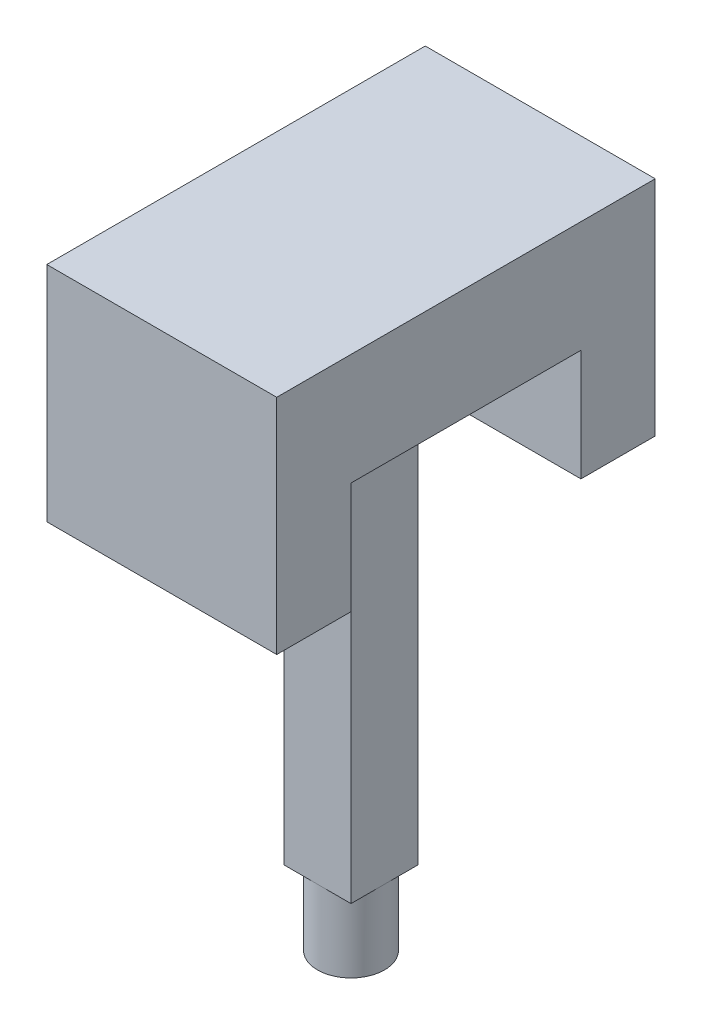
ISO-10303-21;
HEADER;
FILE_DESCRIPTION(('STEP AP214'),'2;1');
FILE_NAME('part.step','',(''),(''),'','','');
FILE_SCHEMA(('AUTOMOTIVE_DESIGN { 1 0 10303 214 1 1 1 1 }'));
ENDSEC;
DATA;
#1=APPLICATION_CONTEXT('core data for automotive mechanical design processes');
#2=APPLICATION_PROTOCOL_DEFINITION('international standard','automotive_design',2000,#1);
#3=PRODUCT_CONTEXT('',#1,'mechanical');
#4=PRODUCT('Part','Part','',(#3));
#5=PRODUCT_RELATED_PRODUCT_CATEGORY('part','',(#4));
#6=PRODUCT_DEFINITION_FORMATION('','',#4);
#7=PRODUCT_DEFINITION_CONTEXT('part definition',#1,'design');
#8=PRODUCT_DEFINITION('design','',#6,#7);
#9=PRODUCT_DEFINITION_SHAPE('','',#8);
#10=(LENGTH_UNIT() NAMED_UNIT(*) SI_UNIT(.MILLI.,.METRE.));
#11=(NAMED_UNIT(*) PLANE_ANGLE_UNIT() SI_UNIT($,.RADIAN.));
#12=(NAMED_UNIT(*) SI_UNIT($,.STERADIAN.) SOLID_ANGLE_UNIT());
#13=UNCERTAINTY_MEASURE_WITH_UNIT(LENGTH_MEASURE(1.E-05),#10,'distance_accuracy_value','');
#14=(GEOMETRIC_REPRESENTATION_CONTEXT(3) GLOBAL_UNCERTAINTY_ASSIGNED_CONTEXT((#13)) GLOBAL_UNIT_ASSIGNED_CONTEXT((#10,
#11,#12)) REPRESENTATION_CONTEXT('',''));
#15=CARTESIAN_POINT('',(0.,0.,0.));
#16=DIRECTION('',(0.,0.,1.));
#17=DIRECTION('',(1.,0.,0.));
#18=AXIS2_PLACEMENT_3D('',#15,#16,#17);
#19=CARTESIAN_POINT('',(0.,10.,0.));
#20=DIRECTION('',(0.,1.,0.));
#21=DIRECTION('',(0.,0.,1.));
#22=AXIS2_PLACEMENT_3D('',#19,#20,#21);
#23=PLANE('',#22);
#24=DIRECTION('',(1.,0.,0.));
#25=VECTOR('',#24,1.);
#26=CARTESIAN_POINT('',(-0.753333333333334,10.,-0.753333333333334));
#27=LINE('',#26,#25);
#28=CARTESIAN_POINT('',(-0.753333333333334,10.,-0.753333333333334));
#29=VERTEX_POINT('',#28);
#30=CARTESIAN_POINT('',(0.753333333333333,10.,-0.753333333333334));
#31=VERTEX_POINT('',#30);
#32=EDGE_CURVE('E229',#29,#31,#27,.T.);
#33=ORIENTED_EDGE('',*,*,#32,.F.);
#34=DIRECTION('',(0.,0.,1.));
#35=VECTOR('',#34,1.);
#36=CARTESIAN_POINT('',(-0.753333333333334,10.,-0.753333333333334));
#37=LINE('',#36,#35);
#38=CARTESIAN_POINT('',(-0.753333333333333,10.,0.753333333333333));
#39=VERTEX_POINT('',#38);
#40=EDGE_CURVE('E221',#29,#39,#37,.T.);
#41=ORIENTED_EDGE('',*,*,#40,.T.);
#42=DIRECTION('',(1.,0.,0.));
#43=VECTOR('',#42,1.);
#44=CARTESIAN_POINT('',(-0.753333333333333,10.,0.753333333333333));
#45=LINE('',#44,#43);
#46=CARTESIAN_POINT('',(0.753333333333333,10.,0.753333333333333));
#47=VERTEX_POINT('',#46);
#48=EDGE_CURVE('E223',#39,#47,#45,.T.);
#49=ORIENTED_EDGE('',*,*,#48,.T.);
#50=DIRECTION('',(0.,0.,1.));
#51=VECTOR('',#50,1.);
#52=CARTESIAN_POINT('',(0.753333333333333,10.,-0.753333333333334));
#53=LINE('',#52,#51);
#54=EDGE_CURVE('E226',#31,#47,#53,.T.);
#55=ORIENTED_EDGE('',*,*,#54,.F.);
#56=EDGE_LOOP('',(#33,#41,#49,#55));
#57=FACE_BOUND('',#56,.T.);
#58=DIRECTION('',(0.,0.,-1.));
#59=VECTOR('',#58,1.);
#60=CARTESIAN_POINT('',(-2.58,10.,0.));
#61=LINE('',#60,#59);
#62=CARTESIAN_POINT('',(-2.58,10.,2.58));
#63=VERTEX_POINT('',#62);
#64=CARTESIAN_POINT('',(-2.58,10.,-2.58));
#65=VERTEX_POINT('',#64);
#66=EDGE_CURVE('E62',#63,#65,#61,.T.);
#67=ORIENTED_EDGE('',*,*,#66,.T.);
#68=DIRECTION('',(1.,0.,0.));
#69=VECTOR('',#68,1.);
#70=CARTESIAN_POINT('',(0.,10.,-2.58));
#71=LINE('',#70,#69);
#72=CARTESIAN_POINT('',(2.58,10.,-2.58));
#73=VERTEX_POINT('',#72);
#74=EDGE_CURVE('E67',#65,#73,#71,.T.);
#75=ORIENTED_EDGE('',*,*,#74,.T.);
#76=DIRECTION('',(0.,0.,-1.));
#77=VECTOR('',#76,1.);
#78=CARTESIAN_POINT('',(2.58,10.,0.));
#79=LINE('',#78,#77);
#80=CARTESIAN_POINT('',(2.58,10.,2.58));
#81=VERTEX_POINT('',#80);
#82=EDGE_CURVE('E154',#81,#73,#79,.T.);
#83=ORIENTED_EDGE('',*,*,#82,.F.);
#84=DIRECTION('',(1.,0.,0.));
#85=VECTOR('',#84,1.);
#86=CARTESIAN_POINT('',(0.,10.,2.58));
#87=LINE('',#86,#85);
#88=EDGE_CURVE('E182',#63,#81,#87,.T.);
#89=ORIENTED_EDGE('',*,*,#88,.F.);
#90=EDGE_LOOP('',(#67,#75,#83,#89));
#91=FACE_BOUND('',#90,.T.);
#92=ADVANCED_FACE('F44',(#57,#91),#23,.F.);
#93=CARTESIAN_POINT('',(0.,0.,0.));
#94=DIRECTION('',(0.,1.,0.));
#95=DIRECTION('',(0.,0.,1.));
#96=AXIS2_PLACEMENT_3D('',#93,#94,#95);
#97=PLANE('',#96);
#98=CARTESIAN_POINT('',(0.,0.,0.));
#99=DIRECTION('',(0.,-1.,0.));
#100=DIRECTION('',(0.,0.,-1.));
#101=AXIS2_PLACEMENT_3D('',#98,#99,#100);
#102=CIRCLE('',#101,0.753333333333333);
#103=CARTESIAN_POINT('',(0.,0.,-0.753333333333333));
#104=VERTEX_POINT('',#103);
#105=CARTESIAN_POINT('',(0.753333333333333,0.,0.));
#106=VERTEX_POINT('',#105);
#107=EDGE_CURVE('E55',#104,#106,#102,.T.);
#108=ORIENTED_EDGE('',*,*,#107,.F.);
#109=DIRECTION('',(1.,0.,0.));
#110=VECTOR('',#109,1.);
#111=CARTESIAN_POINT('',(-0.753333333333334,0.,-0.753333333333334));
#112=LINE('',#111,#110);
#113=CARTESIAN_POINT('',(0.753333333333333,0.,-0.753333333333334));
#114=VERTEX_POINT('',#113);
#115=EDGE_CURVE('E244',#104,#114,#112,.T.);
#116=ORIENTED_EDGE('',*,*,#115,.T.);
#117=DIRECTION('',(0.,0.,1.));
#118=VECTOR('',#117,1.);
#119=CARTESIAN_POINT('',(0.753333333333333,0.,-0.753333333333334));
#120=LINE('',#119,#118);
#121=EDGE_CURVE('E241',#114,#106,#120,.T.);
#122=ORIENTED_EDGE('',*,*,#121,.T.);
#123=EDGE_LOOP('',(#108,#116,#122));
#124=FACE_BOUND('',#123,.T.);
#125=ADVANCED_FACE('F281',(#124),#97,.F.);
#126=CARTESIAN_POINT('',(0.,0.,0.753333333333333));
#127=VERTEX_POINT('',#126);
#128=EDGE_CURVE('E11',#106,#127,#102,.T.);
#129=ORIENTED_EDGE('',*,*,#128,.F.);
#130=CARTESIAN_POINT('',(0.753333333333333,0.,0.753333333333333));
#131=VERTEX_POINT('',#130);
#132=EDGE_CURVE('E240',#106,#131,#120,.T.);
#133=ORIENTED_EDGE('',*,*,#132,.T.);
#134=DIRECTION('',(1.,0.,0.));
#135=VECTOR('',#134,1.);
#136=CARTESIAN_POINT('',(-0.753333333333333,0.,0.753333333333333));
#137=LINE('',#136,#135);
#138=EDGE_CURVE('E236',#127,#131,#137,.T.);
#139=ORIENTED_EDGE('',*,*,#138,.F.);
#140=EDGE_LOOP('',(#129,#133,#139));
#141=FACE_BOUND('',#140,.T.);
#142=ADVANCED_FACE('F269',(#141),#97,.F.);
#143=CARTESIAN_POINT('',(-0.753333333333333,0.,0.));
#144=VERTEX_POINT('',#143);
#145=EDGE_CURVE('E53',#127,#144,#102,.T.);
#146=ORIENTED_EDGE('',*,*,#145,.F.);
#147=CARTESIAN_POINT('',(-0.753333333333333,0.,0.753333333333333));
#148=VERTEX_POINT('',#147);
#149=EDGE_CURVE('E237',#148,#127,#137,.T.);
#150=ORIENTED_EDGE('',*,*,#149,.F.);
#151=DIRECTION('',(0.,0.,1.));
#152=VECTOR('',#151,1.);
#153=CARTESIAN_POINT('',(-0.753333333333334,0.,-0.753333333333334));
#154=LINE('',#153,#152);
#155=EDGE_CURVE('E217',#144,#148,#154,.T.);
#156=ORIENTED_EDGE('',*,*,#155,.F.);
#157=EDGE_LOOP('',(#146,#150,#156));
#158=FACE_BOUND('',#157,.T.);
#159=ADVANCED_FACE('F266',(#158),#97,.F.);
#160=CARTESIAN_POINT('',(-0.753333333333334,10.,-0.753333333333334));
#161=DIRECTION('',(1.,0.,0.));
#162=DIRECTION('',(0.,0.,-1.));
#163=AXIS2_PLACEMENT_3D('',#160,#161,#162);
#164=PLANE('',#163);
#165=CARTESIAN_POINT('',(-0.753333333333334,0.,-0.753333333333334));
#166=VERTEX_POINT('',#165);
#167=EDGE_CURVE('E233',#166,#144,#154,.T.);
#168=ORIENTED_EDGE('',*,*,#167,.T.);
#169=ORIENTED_EDGE('',*,*,#155,.T.);
#170=DIRECTION('',(0.,-1.,0.));
#171=VECTOR('',#170,1.);
#172=CARTESIAN_POINT('',(-0.753333333333333,10.,0.753333333333333));
#173=LINE('',#172,#171);
#174=EDGE_CURVE('E48',#39,#148,#173,.T.);
#175=ORIENTED_EDGE('',*,*,#174,.F.);
#176=ORIENTED_EDGE('',*,*,#40,.F.);
#177=DIRECTION('',(0.,-1.,0.));
#178=VECTOR('',#177,1.);
#179=CARTESIAN_POINT('',(-0.753333333333334,10.,-0.753333333333334));
#180=LINE('',#179,#178);
#181=EDGE_CURVE('E232',#29,#166,#180,.T.);
#182=ORIENTED_EDGE('',*,*,#181,.T.);
#183=EDGE_LOOP('',(#168,#169,#175,#176,#182));
#184=FACE_BOUND('',#183,.T.);
#185=ADVANCED_FACE('F46',(#184),#164,.F.);
#186=CARTESIAN_POINT('',(-0.753333333333333,10.,0.753333333333333));
#187=DIRECTION('',(0.,0.,-1.));
#188=DIRECTION('',(-1.,0.,0.));
#189=AXIS2_PLACEMENT_3D('',#186,#187,#188);
#190=PLANE('',#189);
#191=ORIENTED_EDGE('',*,*,#149,.T.);
#192=ORIENTED_EDGE('',*,*,#138,.T.);
#193=DIRECTION('',(0.,-1.,0.));
#194=VECTOR('',#193,1.);
#195=CARTESIAN_POINT('',(0.753333333333333,10.,0.753333333333333));
#196=LINE('',#195,#194);
#197=EDGE_CURVE('E249',#47,#131,#196,.T.);
#198=ORIENTED_EDGE('',*,*,#197,.F.);
#199=ORIENTED_EDGE('',*,*,#48,.F.);
#200=ORIENTED_EDGE('',*,*,#174,.T.);
#201=EDGE_LOOP('',(#191,#192,#198,#199,#200));
#202=FACE_BOUND('',#201,.T.);
#203=ADVANCED_FACE('F270',(#202),#190,.F.);
#204=CARTESIAN_POINT('',(0.753333333333333,10.,-0.753333333333334));
#205=DIRECTION('',(1.,0.,0.));
#206=DIRECTION('',(0.,0.,-1.));
#207=AXIS2_PLACEMENT_3D('',#204,#205,#206);
#208=PLANE('',#207);
#209=ORIENTED_EDGE('',*,*,#121,.F.);
#210=DIRECTION('',(0.,-1.,0.));
#211=VECTOR('',#210,1.);
#212=CARTESIAN_POINT('',(0.753333333333333,10.,-0.753333333333334));
#213=LINE('',#212,#211);
#214=EDGE_CURVE('E247',#31,#114,#213,.T.);
#215=ORIENTED_EDGE('',*,*,#214,.F.);
#216=ORIENTED_EDGE('',*,*,#54,.T.);
#217=ORIENTED_EDGE('',*,*,#197,.T.);
#218=ORIENTED_EDGE('',*,*,#132,.F.);
#219=EDGE_LOOP('',(#209,#215,#216,#217,#218));
#220=FACE_BOUND('',#219,.T.);
#221=ADVANCED_FACE('F272',(#220),#208,.T.);
#222=CARTESIAN_POINT('',(-0.753333333333334,10.,-0.753333333333334));
#223=DIRECTION('',(0.,0.,-1.));
#224=DIRECTION('',(-1.,0.,0.));
#225=AXIS2_PLACEMENT_3D('',#222,#223,#224);
#226=PLANE('',#225);
#227=EDGE_CURVE('E224',#166,#104,#112,.T.);
#228=ORIENTED_EDGE('',*,*,#227,.F.);
#229=ORIENTED_EDGE('',*,*,#181,.F.);
#230=ORIENTED_EDGE('',*,*,#32,.T.);
#231=ORIENTED_EDGE('',*,*,#214,.T.);
#232=ORIENTED_EDGE('',*,*,#115,.F.);
#233=EDGE_LOOP('',(#228,#229,#230,#231,#232));
#234=FACE_BOUND('',#233,.T.);
#235=ADVANCED_FACE('F277',(#234),#226,.T.);
#236=EDGE_CURVE('E220',#144,#104,#102,.T.);
#237=ORIENTED_EDGE('',*,*,#236,.F.);
#238=ORIENTED_EDGE('',*,*,#167,.F.);
#239=ORIENTED_EDGE('',*,*,#227,.T.);
#240=EDGE_LOOP('',(#237,#238,#239));
#241=FACE_BOUND('',#240,.T.);
#242=ADVANCED_FACE('F291',(#241),#97,.F.);
#243=CARTESIAN_POINT('',(0.,-1.66666666666667,0.));
#244=DIRECTION('',(0.,1.,0.));
#245=DIRECTION('',(0.,0.,1.));
#246=AXIS2_PLACEMENT_3D('',#243,#244,#245);
#247=CYLINDRICAL_SURFACE('',#246,0.753333333333333);
#248=CARTESIAN_POINT('',(0.,-1.66666666666667,0.));
#249=DIRECTION('',(0.,-1.,0.));
#250=DIRECTION('',(0.,0.,-1.));
#251=AXIS2_PLACEMENT_3D('',#248,#249,#250);
#252=CIRCLE('',#251,0.753333333333333);
#253=CARTESIAN_POINT('',(0.,-1.66666666666667,-0.753333333333333));
#254=VERTEX_POINT('',#253);
#255=EDGE_CURVE('E215',#254,#254,#252,.T.);
#256=ORIENTED_EDGE('',*,*,#255,.F.);
#257=EDGE_LOOP('',(#256));
#258=FACE_BOUND('',#257,.T.);
#259=ORIENTED_EDGE('',*,*,#107,.T.);
#260=ORIENTED_EDGE('',*,*,#128,.T.);
#261=ORIENTED_EDGE('',*,*,#145,.T.);
#262=ORIENTED_EDGE('',*,*,#236,.T.);
#263=EDGE_LOOP('',(#259,#260,#261,#262));
#264=FACE_BOUND('',#263,.T.);
#265=ADVANCED_FACE('F261',(#258,#264),#247,.T.);
#266=CARTESIAN_POINT('',(0.,-1.66666666666667,0.));
#267=DIRECTION('',(0.,-1.,0.));
#268=DIRECTION('',(0.,0.,-1.));
#269=AXIS2_PLACEMENT_3D('',#266,#267,#268);
#270=PLANE('',#269);
#271=ORIENTED_EDGE('',*,*,#255,.T.);
#272=EDGE_LOOP('',(#271));
#273=FACE_BOUND('',#272,.T.);
#274=ADVANCED_FACE('F308',(#273),#270,.T.);
#275=CARTESIAN_POINT('',(-2.58,12.5,0.));
#276=DIRECTION('',(-1.,0.,0.));
#277=DIRECTION('',(0.,0.,1.));
#278=AXIS2_PLACEMENT_3D('',#275,#276,#277);
#279=PLANE('',#278);
#280=ORIENTED_EDGE('',*,*,#66,.F.);
#281=DIRECTION('',(0.,1.,0.));
#282=VECTOR('',#281,1.);
#283=CARTESIAN_POINT('',(-2.58,7.5,2.58));
#284=LINE('',#283,#282);
#285=CARTESIAN_POINT('',(-2.58,7.5,2.58));
#286=VERTEX_POINT('',#285);
#287=EDGE_CURVE('E172',#286,#63,#284,.T.);
#288=ORIENTED_EDGE('',*,*,#287,.F.);
#289=DIRECTION('',(0.,0.,1.));
#290=VECTOR('',#289,1.);
#291=CARTESIAN_POINT('',(-2.58,7.5,0.));
#292=LINE('',#291,#290);
#293=CARTESIAN_POINT('',(-2.58,7.5,4.24666666666667));
#294=VERTEX_POINT('',#293);
#295=EDGE_CURVE('E184',#286,#294,#292,.T.);
#296=ORIENTED_EDGE('',*,*,#295,.T.);
#297=DIRECTION('',(0.,-1.,0.));
#298=VECTOR('',#297,1.);
#299=CARTESIAN_POINT('',(-2.58,12.5,4.24666666666667));
#300=LINE('',#299,#298);
#301=CARTESIAN_POINT('',(-2.58,12.5,4.24666666666667));
#302=VERTEX_POINT('',#301);
#303=EDGE_CURVE('E213',#302,#294,#300,.T.);
#304=ORIENTED_EDGE('',*,*,#303,.F.);
#305=DIRECTION('',(0.,0.,-1.));
#306=VECTOR('',#305,1.);
#307=CARTESIAN_POINT('',(-2.58,12.5,0.));
#308=LINE('',#307,#306);
#309=CARTESIAN_POINT('',(-2.58,12.5,-4.24666666666667));
#310=VERTEX_POINT('',#309);
#311=EDGE_CURVE('E195',#302,#310,#308,.T.);
#312=ORIENTED_EDGE('',*,*,#311,.T.);
#313=DIRECTION('',(0.,-1.,0.));
#314=VECTOR('',#313,1.);
#315=CARTESIAN_POINT('',(-2.58,12.5,-4.24666666666667));
#316=LINE('',#315,#314);
#317=CARTESIAN_POINT('',(-2.58,7.5,-4.24666666666667));
#318=VERTEX_POINT('',#317);
#319=EDGE_CURVE('E205',#310,#318,#316,.T.);
#320=ORIENTED_EDGE('',*,*,#319,.T.);
#321=DIRECTION('',(0.,0.,-1.));
#322=VECTOR('',#321,1.);
#323=CARTESIAN_POINT('',(-2.58,7.5,0.));
#324=LINE('',#323,#322);
#325=CARTESIAN_POINT('',(-2.58,7.5,-2.58));
#326=VERTEX_POINT('',#325);
#327=EDGE_CURVE('E158',#326,#318,#324,.T.);
#328=ORIENTED_EDGE('',*,*,#327,.F.);
#329=DIRECTION('',(0.,1.,0.));
#330=VECTOR('',#329,1.);
#331=CARTESIAN_POINT('',(-2.58,7.5,-2.58));
#332=LINE('',#331,#330);
#333=EDGE_CURVE('E157',#326,#65,#332,.T.);
#334=ORIENTED_EDGE('',*,*,#333,.T.);
#335=EDGE_LOOP('',(#280,#288,#296,#304,#312,#320,#328,#334));
#336=FACE_BOUND('',#335,.T.);
#337=ADVANCED_FACE('F305',(#336),#279,.T.);
#338=CARTESIAN_POINT('',(0.,12.5,4.24666666666667));
#339=DIRECTION('',(0.,0.,-1.));
#340=DIRECTION('',(-1.,0.,0.));
#341=AXIS2_PLACEMENT_3D('',#338,#339,#340);
#342=PLANE('',#341);
#343=ORIENTED_EDGE('',*,*,#303,.T.);
#344=DIRECTION('',(1.,0.,0.));
#345=VECTOR('',#344,1.);
#346=CARTESIAN_POINT('',(0.,7.5,4.24666666666667));
#347=LINE('',#346,#345);
#348=CARTESIAN_POINT('',(2.58,7.5,4.24666666666667));
#349=VERTEX_POINT('',#348);
#350=EDGE_CURVE('E187',#294,#349,#347,.T.);
#351=ORIENTED_EDGE('',*,*,#350,.T.);
#352=DIRECTION('',(0.,-1.,0.));
#353=VECTOR('',#352,1.);
#354=CARTESIAN_POINT('',(2.58,12.5,4.24666666666667));
#355=LINE('',#354,#353);
#356=CARTESIAN_POINT('',(2.58,12.5,4.24666666666667));
#357=VERTEX_POINT('',#356);
#358=EDGE_CURVE('E211',#357,#349,#355,.T.);
#359=ORIENTED_EDGE('',*,*,#358,.F.);
#360=DIRECTION('',(1.,0.,0.));
#361=VECTOR('',#360,1.);
#362=CARTESIAN_POINT('',(0.,12.5,4.24666666666667));
#363=LINE('',#362,#361);
#364=EDGE_CURVE('E198',#302,#357,#363,.T.);
#365=ORIENTED_EDGE('',*,*,#364,.F.);
#366=EDGE_LOOP('',(#343,#351,#359,#365));
#367=FACE_BOUND('',#366,.T.);
#368=ADVANCED_FACE('F302',(#367),#342,.F.);
#369=CARTESIAN_POINT('',(2.58,12.5,0.));
#370=DIRECTION('',(-1.,0.,0.));
#371=DIRECTION('',(0.,0.,1.));
#372=AXIS2_PLACEMENT_3D('',#369,#370,#371);
#373=PLANE('',#372);
#374=ORIENTED_EDGE('',*,*,#358,.T.);
#375=DIRECTION('',(0.,0.,1.));
#376=VECTOR('',#375,1.);
#377=CARTESIAN_POINT('',(2.58,7.5,0.));
#378=LINE('',#377,#376);
#379=CARTESIAN_POINT('',(2.58,7.5,2.58));
#380=VERTEX_POINT('',#379);
#381=EDGE_CURVE('E178',#380,#349,#378,.T.);
#382=ORIENTED_EDGE('',*,*,#381,.F.);
#383=DIRECTION('',(0.,1.,0.));
#384=VECTOR('',#383,1.);
#385=CARTESIAN_POINT('',(2.58,7.5,2.58));
#386=LINE('',#385,#384);
#387=EDGE_CURVE('E190',#380,#81,#386,.T.);
#388=ORIENTED_EDGE('',*,*,#387,.T.);
#389=ORIENTED_EDGE('',*,*,#82,.T.);
#390=DIRECTION('',(0.,1.,0.));
#391=VECTOR('',#390,1.);
#392=CARTESIAN_POINT('',(2.58,7.5,-2.58));
#393=LINE('',#392,#391);
#394=CARTESIAN_POINT('',(2.58,7.5,-2.58));
#395=VERTEX_POINT('',#394);
#396=EDGE_CURVE('E149',#395,#73,#393,.T.);
#397=ORIENTED_EDGE('',*,*,#396,.F.);
#398=DIRECTION('',(0.,0.,-1.));
#399=VECTOR('',#398,1.);
#400=CARTESIAN_POINT('',(2.58,7.5,0.));
#401=LINE('',#400,#399);
#402=CARTESIAN_POINT('',(2.58,7.5,-4.24666666666667));
#403=VERTEX_POINT('',#402);
#404=EDGE_CURVE('E153',#395,#403,#401,.T.);
#405=ORIENTED_EDGE('',*,*,#404,.T.);
#406=DIRECTION('',(0.,-1.,0.));
#407=VECTOR('',#406,1.);
#408=CARTESIAN_POINT('',(2.58,12.5,-4.24666666666667));
#409=LINE('',#408,#407);
#410=CARTESIAN_POINT('',(2.58,12.5,-4.24666666666667));
#411=VERTEX_POINT('',#410);
#412=EDGE_CURVE('E209',#411,#403,#409,.T.);
#413=ORIENTED_EDGE('',*,*,#412,.F.);
#414=DIRECTION('',(0.,0.,-1.));
#415=VECTOR('',#414,1.);
#416=CARTESIAN_POINT('',(2.58,12.5,0.));
#417=LINE('',#416,#415);
#418=EDGE_CURVE('E200',#357,#411,#417,.T.);
#419=ORIENTED_EDGE('',*,*,#418,.F.);
#420=EDGE_LOOP('',(#374,#382,#388,#389,#397,#405,#413,#419));
#421=FACE_BOUND('',#420,.T.);
#422=ADVANCED_FACE('F151',(#421),#373,.F.);
#423=CARTESIAN_POINT('',(0.,12.5,-4.24666666666667));
#424=DIRECTION('',(0.,0.,-1.));
#425=DIRECTION('',(-1.,0.,0.));
#426=AXIS2_PLACEMENT_3D('',#423,#424,#425);
#427=PLANE('',#426);
#428=ORIENTED_EDGE('',*,*,#412,.T.);
#429=DIRECTION('',(1.,0.,0.));
#430=VECTOR('',#429,1.);
#431=CARTESIAN_POINT('',(0.,7.5,-4.24666666666667));
#432=LINE('',#431,#430);
#433=EDGE_CURVE('E167',#318,#403,#432,.T.);
#434=ORIENTED_EDGE('',*,*,#433,.F.);
#435=ORIENTED_EDGE('',*,*,#319,.F.);
#436=DIRECTION('',(1.,0.,0.));
#437=VECTOR('',#436,1.);
#438=CARTESIAN_POINT('',(0.,12.5,-4.24666666666667));
#439=LINE('',#438,#437);
#440=EDGE_CURVE('E202',#310,#411,#439,.T.);
#441=ORIENTED_EDGE('',*,*,#440,.T.);
#442=EDGE_LOOP('',(#428,#434,#435,#441));
#443=FACE_BOUND('',#442,.T.);
#444=ADVANCED_FACE('F296',(#443),#427,.T.);
#445=CARTESIAN_POINT('',(0.,12.5,0.));
#446=DIRECTION('',(0.,1.,0.));
#447=DIRECTION('',(0.,0.,1.));
#448=AXIS2_PLACEMENT_3D('',#445,#446,#447);
#449=PLANE('',#448);
#450=ORIENTED_EDGE('',*,*,#311,.F.);
#451=ORIENTED_EDGE('',*,*,#364,.T.);
#452=ORIENTED_EDGE('',*,*,#418,.T.);
#453=ORIENTED_EDGE('',*,*,#440,.F.);
#454=EDGE_LOOP('',(#450,#451,#452,#453));
#455=FACE_BOUND('',#454,.T.);
#456=ADVANCED_FACE('F294',(#455),#449,.T.);
#457=CARTESIAN_POINT('',(0.,7.5,-2.58));
#458=DIRECTION('',(0.,0.,1.));
#459=DIRECTION('',(1.,0.,0.));
#460=AXIS2_PLACEMENT_3D('',#457,#458,#459);
#461=PLANE('',#460);
#462=ORIENTED_EDGE('',*,*,#74,.F.);
#463=ORIENTED_EDGE('',*,*,#333,.F.);
#464=DIRECTION('',(1.,0.,0.));
#465=VECTOR('',#464,1.);
#466=CARTESIAN_POINT('',(0.,7.5,-2.58));
#467=LINE('',#466,#465);
#468=EDGE_CURVE('E165',#326,#395,#467,.T.);
#469=ORIENTED_EDGE('',*,*,#468,.T.);
#470=ORIENTED_EDGE('',*,*,#396,.T.);
#471=EDGE_LOOP('',(#462,#463,#469,#470));
#472=FACE_BOUND('',#471,.T.);
#473=ADVANCED_FACE('F169',(#472),#461,.T.);
#474=CARTESIAN_POINT('',(0.,7.5,0.));
#475=DIRECTION('',(0.,1.,0.));
#476=DIRECTION('',(0.,0.,1.));
#477=AXIS2_PLACEMENT_3D('',#474,#475,#476);
#478=PLANE('',#477);
#479=ORIENTED_EDGE('',*,*,#468,.F.);
#480=ORIENTED_EDGE('',*,*,#327,.T.);
#481=ORIENTED_EDGE('',*,*,#433,.T.);
#482=ORIENTED_EDGE('',*,*,#404,.F.);
#483=EDGE_LOOP('',(#479,#480,#481,#482));
#484=FACE_BOUND('',#483,.T.);
#485=ADVANCED_FACE('F163',(#484),#478,.F.);
#486=CARTESIAN_POINT('',(0.,7.5,2.58));
#487=DIRECTION('',(0.,0.,1.));
#488=DIRECTION('',(1.,0.,0.));
#489=AXIS2_PLACEMENT_3D('',#486,#487,#488);
#490=PLANE('',#489);
#491=ORIENTED_EDGE('',*,*,#88,.T.);
#492=ORIENTED_EDGE('',*,*,#387,.F.);
#493=DIRECTION('',(1.,0.,0.));
#494=VECTOR('',#493,1.);
#495=CARTESIAN_POINT('',(0.,7.5,2.58));
#496=LINE('',#495,#494);
#497=EDGE_CURVE('E181',#286,#380,#496,.T.);
#498=ORIENTED_EDGE('',*,*,#497,.F.);
#499=ORIENTED_EDGE('',*,*,#287,.T.);
#500=EDGE_LOOP('',(#491,#492,#498,#499));
#501=FACE_BOUND('',#500,.T.);
#502=ADVANCED_FACE('F412',(#501),#490,.F.);
#503=CARTESIAN_POINT('',(0.,7.5,0.));
#504=DIRECTION('',(0.,1.,0.));
#505=DIRECTION('',(0.,0.,1.));
#506=AXIS2_PLACEMENT_3D('',#503,#504,#505);
#507=PLANE('',#506);
#508=ORIENTED_EDGE('',*,*,#381,.T.);
#509=ORIENTED_EDGE('',*,*,#350,.F.);
#510=ORIENTED_EDGE('',*,*,#295,.F.);
#511=ORIENTED_EDGE('',*,*,#497,.T.);
#512=EDGE_LOOP('',(#508,#509,#510,#511));
#513=FACE_BOUND('',#512,.T.);
#514=ADVANCED_FACE('F421',(#513),#507,.F.);
#515=CLOSED_SHELL('',(#92,#125,#142,#159,#185,#203,#221,#235,#242,#265,#274,#337,#368,#422,#444,
#456,#473,#485,#502,#514));
#516=MANIFOLD_SOLID_BREP('B2',#515);
#517=ADVANCED_BREP_SHAPE_REPRESENTATION('',(#18,#516),#14);
#518=SHAPE_DEFINITION_REPRESENTATION(#9,#517);
ENDSEC;
END-ISO-10303-21;
